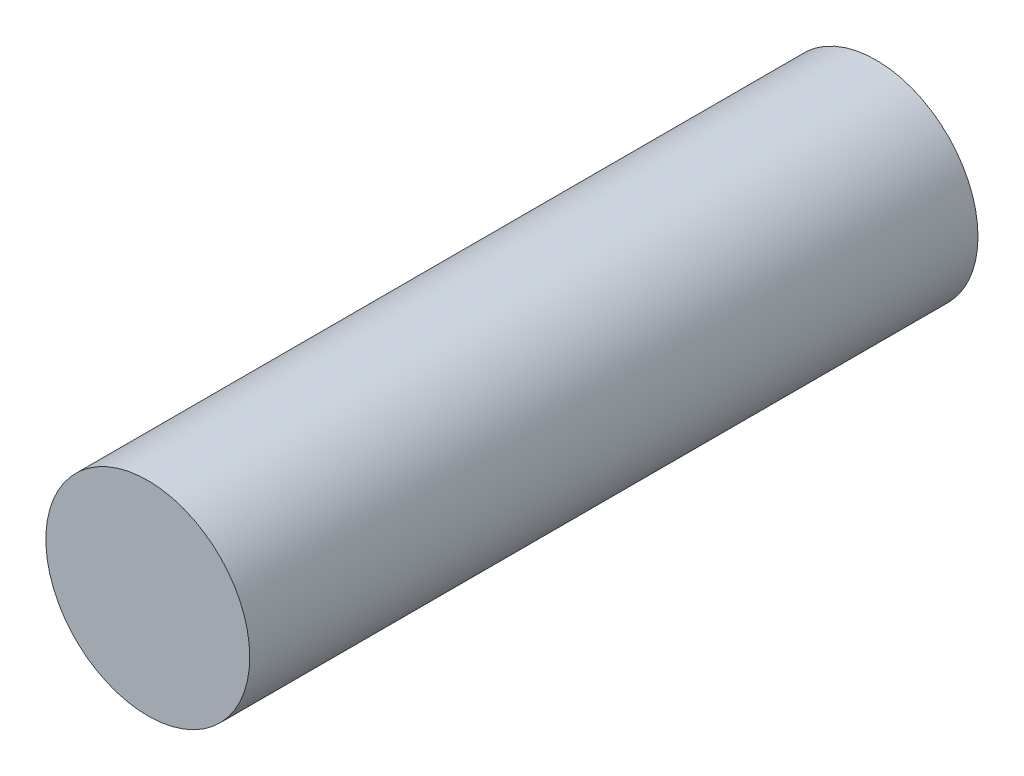
ISO-10303-21;
HEADER;
FILE_DESCRIPTION(('STEP AP214'),'2;1');
FILE_NAME('part.step','',(''),(''),'','','');
FILE_SCHEMA(('AUTOMOTIVE_DESIGN { 1 0 10303 214 1 1 1 1 }'));
ENDSEC;
DATA;
#1=APPLICATION_CONTEXT('core data for automotive mechanical design processes');
#2=APPLICATION_PROTOCOL_DEFINITION('international standard','automotive_design',2000,#1);
#3=PRODUCT_CONTEXT('',#1,'mechanical');
#4=PRODUCT('Part','Part','',(#3));
#5=PRODUCT_RELATED_PRODUCT_CATEGORY('part','',(#4));
#6=PRODUCT_DEFINITION_FORMATION('','',#4);
#7=PRODUCT_DEFINITION_CONTEXT('part definition',#1,'design');
#8=PRODUCT_DEFINITION('design','',#6,#7);
#9=PRODUCT_DEFINITION_SHAPE('','',#8);
#10=(LENGTH_UNIT() NAMED_UNIT(*) SI_UNIT(.MILLI.,.METRE.));
#11=(NAMED_UNIT(*) PLANE_ANGLE_UNIT() SI_UNIT($,.RADIAN.));
#12=(NAMED_UNIT(*) SI_UNIT($,.STERADIAN.) SOLID_ANGLE_UNIT());
#13=UNCERTAINTY_MEASURE_WITH_UNIT(LENGTH_MEASURE(1.E-05),#10,'distance_accuracy_value','');
#14=(GEOMETRIC_REPRESENTATION_CONTEXT(3) GLOBAL_UNCERTAINTY_ASSIGNED_CONTEXT((#13)) GLOBAL_UNIT_ASSIGNED_CONTEXT((#10,
#11,#12)) REPRESENTATION_CONTEXT('',''));
#15=CARTESIAN_POINT('',(0.,0.,0.));
#16=DIRECTION('',(0.,0.,1.));
#17=DIRECTION('',(1.,0.,0.));
#18=AXIS2_PLACEMENT_3D('',#15,#16,#17);
#19=CARTESIAN_POINT('',(655.,14.,-60.));
#20=DIRECTION('',(0.,0.,1.));
#21=DIRECTION('',(1.,0.,0.));
#22=AXIS2_PLACEMENT_3D('',#19,#20,#21);
#23=CYLINDRICAL_SURFACE('',#22,14.);
#24=CARTESIAN_POINT('',(655.,14.,-60.));
#25=DIRECTION('',(0.,0.,1.));
#26=DIRECTION('',(1.,0.,0.));
#27=AXIS2_PLACEMENT_3D('',#24,#25,#26);
#28=CIRCLE('',#27,14.);
#29=CARTESIAN_POINT('',(669.,14.,-60.));
#30=VERTEX_POINT('',#29);
#31=EDGE_CURVE('E10',#30,#30,#28,.T.);
#32=ORIENTED_EDGE('',*,*,#31,.T.);
#33=EDGE_LOOP('',(#32));
#34=FACE_BOUND('',#33,.T.);
#35=CARTESIAN_POINT('',(655.,14.,40.));
#36=DIRECTION('',(0.,0.,1.));
#37=DIRECTION('',(1.,0.,0.));
#38=AXIS2_PLACEMENT_3D('',#35,#36,#37);
#39=CIRCLE('',#38,14.);
#40=CARTESIAN_POINT('',(669.,14.,40.));
#41=VERTEX_POINT('',#40);
#42=EDGE_CURVE('E40',#41,#41,#39,.T.);
#43=ORIENTED_EDGE('',*,*,#42,.F.);
#44=EDGE_LOOP('',(#43));
#45=FACE_BOUND('',#44,.T.);
#46=ADVANCED_FACE('F37',(#34,#45),#23,.T.);
#47=CARTESIAN_POINT('',(655.,14.,-60.));
#48=DIRECTION('',(0.,0.,1.));
#49=DIRECTION('',(1.,0.,0.));
#50=AXIS2_PLACEMENT_3D('',#47,#48,#49);
#51=PLANE('',#50);
#52=ORIENTED_EDGE('',*,*,#31,.F.);
#53=EDGE_LOOP('',(#52));
#54=FACE_BOUND('',#53,.T.);
#55=ADVANCED_FACE('F52',(#54),#51,.F.);
#56=CARTESIAN_POINT('',(655.,14.,40.));
#57=DIRECTION('',(0.,0.,1.));
#58=DIRECTION('',(1.,0.,0.));
#59=AXIS2_PLACEMENT_3D('',#56,#57,#58);
#60=PLANE('',#59);
#61=ORIENTED_EDGE('',*,*,#42,.T.);
#62=EDGE_LOOP('',(#61));
#63=FACE_BOUND('',#62,.T.);
#64=ADVANCED_FACE('F49',(#63),#60,.T.);
#65=CLOSED_SHELL('',(#46,#55,#64));
#66=MANIFOLD_SOLID_BREP('B2',#65);
#67=ADVANCED_BREP_SHAPE_REPRESENTATION('',(#18,#66),#14);
#68=SHAPE_DEFINITION_REPRESENTATION(#9,#67);
ENDSEC;
END-ISO-10303-21;
